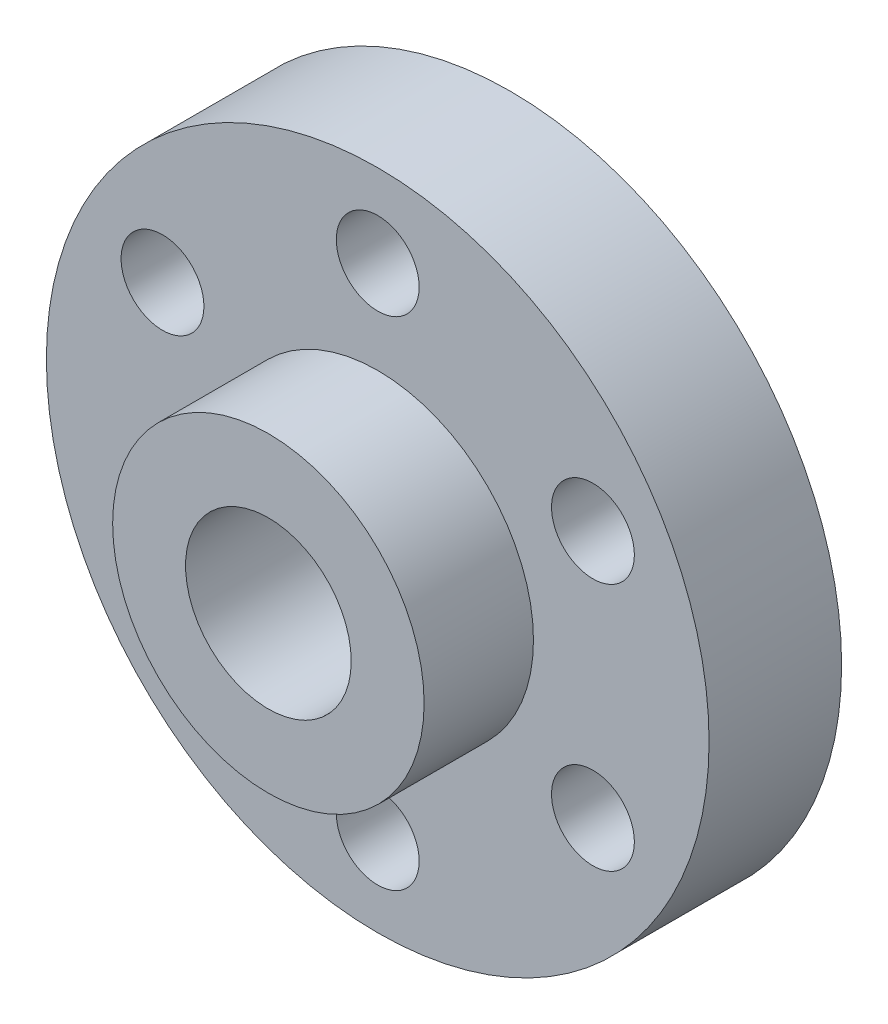
ISO-10303-21;
HEADER;
FILE_DESCRIPTION(('STEP AP214'),'2;1');
FILE_NAME('part.step','',(''),(''),'','','');
FILE_SCHEMA(('AUTOMOTIVE_DESIGN { 1 0 10303 214 1 1 1 1 }'));
ENDSEC;
DATA;
#1=APPLICATION_CONTEXT('core data for automotive mechanical design processes');
#2=APPLICATION_PROTOCOL_DEFINITION('international standard','automotive_design',2000,#1);
#3=PRODUCT_CONTEXT('',#1,'mechanical');
#4=PRODUCT('Part','Part','',(#3));
#5=PRODUCT_RELATED_PRODUCT_CATEGORY('part','',(#4));
#6=PRODUCT_DEFINITION_FORMATION('','',#4);
#7=PRODUCT_DEFINITION_CONTEXT('part definition',#1,'design');
#8=PRODUCT_DEFINITION('design','',#6,#7);
#9=PRODUCT_DEFINITION_SHAPE('','',#8);
#10=(LENGTH_UNIT() NAMED_UNIT(*) SI_UNIT(.MILLI.,.METRE.));
#11=(NAMED_UNIT(*) PLANE_ANGLE_UNIT() SI_UNIT($,.RADIAN.));
#12=(NAMED_UNIT(*) SI_UNIT($,.STERADIAN.) SOLID_ANGLE_UNIT());
#13=UNCERTAINTY_MEASURE_WITH_UNIT(LENGTH_MEASURE(1.E-05),#10,'distance_accuracy_value','');
#14=(GEOMETRIC_REPRESENTATION_CONTEXT(3) GLOBAL_UNCERTAINTY_ASSIGNED_CONTEXT((#13)) GLOBAL_UNIT_ASSIGNED_CONTEXT((#10,
#11,#12)) REPRESENTATION_CONTEXT('',''));
#15=CARTESIAN_POINT('',(0.,0.,0.));
#16=DIRECTION('',(0.,0.,1.));
#17=DIRECTION('',(1.,0.,0.));
#18=AXIS2_PLACEMENT_3D('',#15,#16,#17);
#19=CARTESIAN_POINT('',(0.,0.,5.08));
#20=DIRECTION('',(0.,0.,1.));
#21=DIRECTION('',(1.,0.,0.));
#22=AXIS2_PLACEMENT_3D('',#19,#20,#21);
#23=PLANE('',#22);
#24=CARTESIAN_POINT('',(0.,0.,5.08));
#25=DIRECTION('',(0.,0.,1.));
#26=DIRECTION('',(1.,0.,0.));
#27=AXIS2_PLACEMENT_3D('',#24,#25,#26);
#28=CIRCLE('',#27,5.969);
#29=CARTESIAN_POINT('',(5.969,0.,5.08));
#30=VERTEX_POINT('',#29);
#31=EDGE_CURVE('E100',#30,#30,#28,.T.);
#32=ORIENTED_EDGE('',*,*,#31,.F.);
#33=EDGE_LOOP('',(#32));
#34=FACE_BOUND('',#33,.T.);
#35=CARTESIAN_POINT('',(-8.24889197104678,-4.7625,5.08));
#36=DIRECTION('',(0.,0.,1.));
#37=DIRECTION('',(1.,0.,0.));
#38=AXIS2_PLACEMENT_3D('',#35,#36,#37);
#39=CIRCLE('',#38,1.5875);
#40=CARTESIAN_POINT('',(-6.66139197104678,-4.7625,5.08));
#41=VERTEX_POINT('',#40);
#42=EDGE_CURVE('E80',#41,#41,#39,.T.);
#43=ORIENTED_EDGE('',*,*,#42,.F.);
#44=EDGE_LOOP('',(#43));
#45=FACE_BOUND('',#44,.T.);
#46=CARTESIAN_POINT('',(8.24889197104678,-4.7625,5.08));
#47=DIRECTION('',(0.,0.,1.));
#48=DIRECTION('',(1.,0.,0.));
#49=AXIS2_PLACEMENT_3D('',#46,#47,#48);
#50=CIRCLE('',#49,1.5875);
#51=CARTESIAN_POINT('',(9.83639197104678,-4.7625,5.08));
#52=VERTEX_POINT('',#51);
#53=EDGE_CURVE('E64',#52,#52,#50,.T.);
#54=ORIENTED_EDGE('',*,*,#53,.F.);
#55=EDGE_LOOP('',(#54));
#56=FACE_BOUND('',#55,.T.);
#57=CARTESIAN_POINT('',(0.,9.525,5.08));
#58=DIRECTION('',(0.,0.,1.));
#59=DIRECTION('',(1.,0.,0.));
#60=AXIS2_PLACEMENT_3D('',#57,#58,#59);
#61=CIRCLE('',#60,1.5875);
#62=CARTESIAN_POINT('',(1.5875,9.525,5.08));
#63=VERTEX_POINT('',#62);
#64=EDGE_CURVE('E50',#63,#63,#61,.T.);
#65=ORIENTED_EDGE('',*,*,#64,.F.);
#66=EDGE_LOOP('',(#65));
#67=FACE_BOUND('',#66,.T.);
#68=CARTESIAN_POINT('',(0.,0.,5.08));
#69=DIRECTION('',(0.,0.,1.));
#70=DIRECTION('',(1.,0.,0.));
#71=AXIS2_PLACEMENT_3D('',#68,#69,#70);
#72=CIRCLE('',#71,12.7);
#73=CARTESIAN_POINT('',(12.7,0.,5.08));
#74=VERTEX_POINT('',#73);
#75=EDGE_CURVE('E10',#74,#74,#72,.T.);
#76=ORIENTED_EDGE('',*,*,#75,.T.);
#77=EDGE_LOOP('',(#76));
#78=FACE_BOUND('',#77,.T.);
#79=CARTESIAN_POINT('',(8.24889197104678,4.7625,5.08));
#80=DIRECTION('',(0.,0.,1.));
#81=DIRECTION('',(1.,0.,0.));
#82=AXIS2_PLACEMENT_3D('',#79,#80,#81);
#83=CIRCLE('',#82,1.5875);
#84=CARTESIAN_POINT('',(9.83639197104679,4.7625,5.08));
#85=VERTEX_POINT('',#84);
#86=EDGE_CURVE('E56',#85,#85,#83,.T.);
#87=ORIENTED_EDGE('',*,*,#86,.F.);
#88=EDGE_LOOP('',(#87));
#89=FACE_BOUND('',#88,.T.);
#90=CARTESIAN_POINT('',(0.,-9.525,5.08));
#91=DIRECTION('',(0.,0.,1.));
#92=DIRECTION('',(1.,0.,0.));
#93=AXIS2_PLACEMENT_3D('',#90,#91,#92);
#94=CIRCLE('',#93,1.5875);
#95=CARTESIAN_POINT('',(1.5875,-9.525,5.08));
#96=VERTEX_POINT('',#95);
#97=EDGE_CURVE('E72',#96,#96,#94,.T.);
#98=ORIENTED_EDGE('',*,*,#97,.F.);
#99=EDGE_LOOP('',(#98));
#100=FACE_BOUND('',#99,.T.);
#101=CARTESIAN_POINT('',(-8.24889197104678,4.7625,5.08));
#102=DIRECTION('',(0.,0.,1.));
#103=DIRECTION('',(1.,0.,0.));
#104=AXIS2_PLACEMENT_3D('',#101,#102,#103);
#105=CIRCLE('',#104,1.5875);
#106=CARTESIAN_POINT('',(-6.66139197104678,4.7625,5.08));
#107=VERTEX_POINT('',#106);
#108=EDGE_CURVE('E88',#107,#107,#105,.T.);
#109=ORIENTED_EDGE('',*,*,#108,.F.);
#110=EDGE_LOOP('',(#109));
#111=FACE_BOUND('',#110,.T.);
#112=ADVANCED_FACE('F37',(#34,#45,#56,#67,#78,#89,#100,#111),#23,.T.);
#113=CARTESIAN_POINT('',(0.,0.,0.));
#114=DIRECTION('',(0.,0.,1.));
#115=DIRECTION('',(1.,0.,0.));
#116=AXIS2_PLACEMENT_3D('',#113,#114,#115);
#117=PLANE('',#116);
#118=CARTESIAN_POINT('',(0.,0.,0.));
#119=DIRECTION('',(0.,0.,1.));
#120=DIRECTION('',(1.,0.,0.));
#121=AXIS2_PLACEMENT_3D('',#118,#119,#120);
#122=CIRCLE('',#121,3.175);
#123=CARTESIAN_POINT('',(3.175,0.,0.));
#124=VERTEX_POINT('',#123);
#125=EDGE_CURVE('E104',#124,#124,#122,.F.);
#126=ORIENTED_EDGE('',*,*,#125,.F.);
#127=EDGE_LOOP('',(#126));
#128=FACE_BOUND('',#127,.T.);
#129=CARTESIAN_POINT('',(0.,0.,0.));
#130=DIRECTION('',(0.,0.,1.));
#131=DIRECTION('',(1.,0.,0.));
#132=AXIS2_PLACEMENT_3D('',#129,#130,#131);
#133=CIRCLE('',#132,12.7);
#134=CARTESIAN_POINT('',(12.7,0.,0.));
#135=VERTEX_POINT('',#134);
#136=EDGE_CURVE('E41',#135,#135,#133,.T.);
#137=ORIENTED_EDGE('',*,*,#136,.F.);
#138=EDGE_LOOP('',(#137));
#139=FACE_BOUND('',#138,.T.);
#140=CARTESIAN_POINT('',(0.,9.525,0.));
#141=DIRECTION('',(0.,0.,1.));
#142=DIRECTION('',(1.,0.,0.));
#143=AXIS2_PLACEMENT_3D('',#140,#141,#142);
#144=CIRCLE('',#143,1.5875);
#145=CARTESIAN_POINT('',(1.5875,9.525,0.));
#146=VERTEX_POINT('',#145);
#147=EDGE_CURVE('E52',#146,#146,#144,.T.);
#148=ORIENTED_EDGE('',*,*,#147,.T.);
#149=EDGE_LOOP('',(#148));
#150=FACE_BOUND('',#149,.T.);
#151=CARTESIAN_POINT('',(8.24889197104678,4.7625,0.));
#152=DIRECTION('',(0.,0.,1.));
#153=DIRECTION('',(1.,0.,0.));
#154=AXIS2_PLACEMENT_3D('',#151,#152,#153);
#155=CIRCLE('',#154,1.5875);
#156=CARTESIAN_POINT('',(9.83639197104679,4.7625,0.));
#157=VERTEX_POINT('',#156);
#158=EDGE_CURVE('E60',#157,#157,#155,.T.);
#159=ORIENTED_EDGE('',*,*,#158,.T.);
#160=EDGE_LOOP('',(#159));
#161=FACE_BOUND('',#160,.T.);
#162=CARTESIAN_POINT('',(8.24889197104678,-4.7625,0.));
#163=DIRECTION('',(0.,0.,1.));
#164=DIRECTION('',(1.,0.,0.));
#165=AXIS2_PLACEMENT_3D('',#162,#163,#164);
#166=CIRCLE('',#165,1.5875);
#167=CARTESIAN_POINT('',(9.83639197104678,-4.7625,0.));
#168=VERTEX_POINT('',#167);
#169=EDGE_CURVE('E68',#168,#168,#166,.T.);
#170=ORIENTED_EDGE('',*,*,#169,.T.);
#171=EDGE_LOOP('',(#170));
#172=FACE_BOUND('',#171,.T.);
#173=CARTESIAN_POINT('',(0.,-9.525,0.));
#174=DIRECTION('',(0.,0.,1.));
#175=DIRECTION('',(1.,0.,0.));
#176=AXIS2_PLACEMENT_3D('',#173,#174,#175);
#177=CIRCLE('',#176,1.5875);
#178=CARTESIAN_POINT('',(1.5875,-9.525,0.));
#179=VERTEX_POINT('',#178);
#180=EDGE_CURVE('E76',#179,#179,#177,.T.);
#181=ORIENTED_EDGE('',*,*,#180,.T.);
#182=EDGE_LOOP('',(#181));
#183=FACE_BOUND('',#182,.T.);
#184=CARTESIAN_POINT('',(-8.24889197104678,-4.7625,0.));
#185=DIRECTION('',(0.,0.,1.));
#186=DIRECTION('',(1.,0.,0.));
#187=AXIS2_PLACEMENT_3D('',#184,#185,#186);
#188=CIRCLE('',#187,1.5875);
#189=CARTESIAN_POINT('',(-6.66139197104678,-4.7625,0.));
#190=VERTEX_POINT('',#189);
#191=EDGE_CURVE('E84',#190,#190,#188,.T.);
#192=ORIENTED_EDGE('',*,*,#191,.T.);
#193=EDGE_LOOP('',(#192));
#194=FACE_BOUND('',#193,.T.);
#195=CARTESIAN_POINT('',(-8.24889197104678,4.7625,0.));
#196=DIRECTION('',(0.,0.,1.));
#197=DIRECTION('',(1.,0.,0.));
#198=AXIS2_PLACEMENT_3D('',#195,#196,#197);
#199=CIRCLE('',#198,1.5875);
#200=CARTESIAN_POINT('',(-6.66139197104678,4.7625,0.));
#201=VERTEX_POINT('',#200);
#202=EDGE_CURVE('E92',#201,#201,#199,.T.);
#203=ORIENTED_EDGE('',*,*,#202,.T.);
#204=EDGE_LOOP('',(#203));
#205=FACE_BOUND('',#204,.T.);
#206=ADVANCED_FACE('F133',(#128,#139,#150,#161,#172,#183,#194,#205),#117,.F.);
#207=CARTESIAN_POINT('',(0.,0.,5.08));
#208=DIRECTION('',(0.,0.,-1.));
#209=DIRECTION('',(-1.,0.,0.));
#210=AXIS2_PLACEMENT_3D('',#207,#208,#209);
#211=CYLINDRICAL_SURFACE('',#210,12.7);
#212=ORIENTED_EDGE('',*,*,#75,.F.);
#213=EDGE_LOOP('',(#212));
#214=FACE_BOUND('',#213,.T.);
#215=ORIENTED_EDGE('',*,*,#136,.T.);
#216=EDGE_LOOP('',(#215));
#217=FACE_BOUND('',#216,.T.);
#218=ADVANCED_FACE('F39',(#214,#217),#211,.T.);
#219=CARTESIAN_POINT('',(0.,9.525,5.08));
#220=DIRECTION('',(0.,0.,-1.));
#221=DIRECTION('',(-1.,0.,0.));
#222=AXIS2_PLACEMENT_3D('',#219,#220,#221);
#223=CYLINDRICAL_SURFACE('',#222,1.5875);
#224=ORIENTED_EDGE('',*,*,#64,.T.);
#225=EDGE_LOOP('',(#224));
#226=FACE_BOUND('',#225,.T.);
#227=ORIENTED_EDGE('',*,*,#147,.F.);
#228=EDGE_LOOP('',(#227));
#229=FACE_BOUND('',#228,.T.);
#230=ADVANCED_FACE('F158',(#226,#229),#223,.F.);
#231=CARTESIAN_POINT('',(8.24889197104678,4.7625,5.08));
#232=DIRECTION('',(0.,0.,-1.));
#233=DIRECTION('',(-1.,0.,0.));
#234=AXIS2_PLACEMENT_3D('',#231,#232,#233);
#235=CYLINDRICAL_SURFACE('',#234,1.5875);
#236=ORIENTED_EDGE('',*,*,#86,.T.);
#237=EDGE_LOOP('',(#236));
#238=FACE_BOUND('',#237,.T.);
#239=ORIENTED_EDGE('',*,*,#158,.F.);
#240=EDGE_LOOP('',(#239));
#241=FACE_BOUND('',#240,.T.);
#242=ADVANCED_FACE('F165',(#238,#241),#235,.F.);
#243=CARTESIAN_POINT('',(8.24889197104678,-4.7625,5.08));
#244=DIRECTION('',(0.,0.,-1.));
#245=DIRECTION('',(-1.,0.,0.));
#246=AXIS2_PLACEMENT_3D('',#243,#244,#245);
#247=CYLINDRICAL_SURFACE('',#246,1.5875);
#248=ORIENTED_EDGE('',*,*,#53,.T.);
#249=EDGE_LOOP('',(#248));
#250=FACE_BOUND('',#249,.T.);
#251=ORIENTED_EDGE('',*,*,#169,.F.);
#252=EDGE_LOOP('',(#251));
#253=FACE_BOUND('',#252,.T.);
#254=ADVANCED_FACE('F169',(#250,#253),#247,.F.);
#255=CARTESIAN_POINT('',(0.,-9.525,5.08));
#256=DIRECTION('',(0.,0.,-1.));
#257=DIRECTION('',(-1.,0.,0.));
#258=AXIS2_PLACEMENT_3D('',#255,#256,#257);
#259=CYLINDRICAL_SURFACE('',#258,1.5875);
#260=ORIENTED_EDGE('',*,*,#97,.T.);
#261=EDGE_LOOP('',(#260));
#262=FACE_BOUND('',#261,.T.);
#263=ORIENTED_EDGE('',*,*,#180,.F.);
#264=EDGE_LOOP('',(#263));
#265=FACE_BOUND('',#264,.T.);
#266=ADVANCED_FACE('F173',(#262,#265),#259,.F.);
#267=CARTESIAN_POINT('',(-8.24889197104678,-4.7625,5.08));
#268=DIRECTION('',(0.,0.,-1.));
#269=DIRECTION('',(-1.,0.,0.));
#270=AXIS2_PLACEMENT_3D('',#267,#268,#269);
#271=CYLINDRICAL_SURFACE('',#270,1.5875);
#272=ORIENTED_EDGE('',*,*,#42,.T.);
#273=EDGE_LOOP('',(#272));
#274=FACE_BOUND('',#273,.T.);
#275=ORIENTED_EDGE('',*,*,#191,.F.);
#276=EDGE_LOOP('',(#275));
#277=FACE_BOUND('',#276,.T.);
#278=ADVANCED_FACE('F149',(#274,#277),#271,.F.);
#279=CARTESIAN_POINT('',(-8.24889197104678,4.7625,5.08));
#280=DIRECTION('',(0.,0.,-1.));
#281=DIRECTION('',(-1.,0.,0.));
#282=AXIS2_PLACEMENT_3D('',#279,#280,#281);
#283=CYLINDRICAL_SURFACE('',#282,1.5875);
#284=ORIENTED_EDGE('',*,*,#108,.T.);
#285=EDGE_LOOP('',(#284));
#286=FACE_BOUND('',#285,.T.);
#287=ORIENTED_EDGE('',*,*,#202,.F.);
#288=EDGE_LOOP('',(#287));
#289=FACE_BOUND('',#288,.T.);
#290=ADVANCED_FACE('F127',(#286,#289),#283,.F.);
#291=CARTESIAN_POINT('',(0.,0.,9.271));
#292=DIRECTION('',(0.,0.,-1.));
#293=DIRECTION('',(-1.,0.,0.));
#294=AXIS2_PLACEMENT_3D('',#291,#292,#293);
#295=CYLINDRICAL_SURFACE('',#294,5.969);
#296=CARTESIAN_POINT('',(0.,0.,9.271));
#297=DIRECTION('',(0.,0.,1.));
#298=DIRECTION('',(1.,0.,0.));
#299=AXIS2_PLACEMENT_3D('',#296,#297,#298);
#300=CIRCLE('',#299,5.969);
#301=CARTESIAN_POINT('',(5.969,0.,9.271));
#302=VERTEX_POINT('',#301);
#303=EDGE_CURVE('E96',#302,#302,#300,.T.);
#304=ORIENTED_EDGE('',*,*,#303,.F.);
#305=EDGE_LOOP('',(#304));
#306=FACE_BOUND('',#305,.T.);
#307=ORIENTED_EDGE('',*,*,#31,.T.);
#308=EDGE_LOOP('',(#307));
#309=FACE_BOUND('',#308,.T.);
#310=ADVANCED_FACE('F121',(#306,#309),#295,.T.);
#311=CARTESIAN_POINT('',(0.,0.,9.271));
#312=DIRECTION('',(0.,0.,1.));
#313=DIRECTION('',(1.,0.,0.));
#314=AXIS2_PLACEMENT_3D('',#311,#312,#313);
#315=PLANE('',#314);
#316=CARTESIAN_POINT('',(0.,0.,9.271));
#317=DIRECTION('',(0.,0.,1.));
#318=DIRECTION('',(1.,0.,0.));
#319=AXIS2_PLACEMENT_3D('',#316,#317,#318);
#320=CIRCLE('',#319,3.175);
#321=CARTESIAN_POINT('',(3.175,0.,9.271));
#322=VERTEX_POINT('',#321);
#323=EDGE_CURVE('E111',#322,#322,#320,.T.);
#324=ORIENTED_EDGE('',*,*,#323,.F.);
#325=EDGE_LOOP('',(#324));
#326=FACE_BOUND('',#325,.T.);
#327=ORIENTED_EDGE('',*,*,#303,.T.);
#328=EDGE_LOOP('',(#327));
#329=FACE_BOUND('',#328,.T.);
#330=ADVANCED_FACE('F118',(#326,#329),#315,.T.);
#331=CARTESIAN_POINT('',(0.,0.,-8.98025612106915));
#332=DIRECTION('',(0.,0.,1.));
#333=DIRECTION('',(1.,0.,0.));
#334=AXIS2_PLACEMENT_3D('',#331,#332,#333);
#335=CYLINDRICAL_SURFACE('',#334,3.175);
#336=CARTESIAN_POINT('',(3.175,0.,0.));
#337=CARTESIAN_POINT('',(3.175,0.,0.0965729166666652));
#338=CARTESIAN_POINT('',(3.175,0.,0.193145833333332));
#339=CARTESIAN_POINT('',(3.175,0.,0.386291666666666));
#340=CARTESIAN_POINT('',(3.175,0.,0.482864583333332));
#341=CARTESIAN_POINT('',(3.175,0.,0.676010416666665));
#342=CARTESIAN_POINT('',(3.175,0.,0.772583333333331));
#343=CARTESIAN_POINT('',(3.175,0.,0.965729166666665));
#344=CARTESIAN_POINT('',(3.175,0.,1.06230208333333));
#345=CARTESIAN_POINT('',(3.175,0.,1.25544791666667));
#346=CARTESIAN_POINT('',(3.175,0.,1.35202083333333));
#347=CARTESIAN_POINT('',(3.175,0.,1.54516666666667));
#348=CARTESIAN_POINT('',(3.175,0.,1.64173958333333));
#349=CARTESIAN_POINT('',(3.175,0.,1.83488541666666));
#350=CARTESIAN_POINT('',(3.175,0.,1.93145833333333));
#351=CARTESIAN_POINT('',(3.175,0.,2.12460416666666));
#352=CARTESIAN_POINT('',(3.175,0.,2.22117708333333));
#353=CARTESIAN_POINT('',(3.175,0.,2.41432291666667));
#354=CARTESIAN_POINT('',(3.175,0.,2.51089583333333));
#355=CARTESIAN_POINT('',(3.175,0.,2.70404166666667));
#356=CARTESIAN_POINT('',(3.175,0.,2.80061458333333));
#357=CARTESIAN_POINT('',(3.175,0.,2.99376041666667));
#358=CARTESIAN_POINT('',(3.175,0.,3.09033333333333));
#359=CARTESIAN_POINT('',(3.175,0.,3.28347916666667));
#360=CARTESIAN_POINT('',(3.175,0.,3.38005208333333));
#361=CARTESIAN_POINT('',(3.175,0.,3.57319791666667));
#362=CARTESIAN_POINT('',(3.175,0.,3.66977083333333));
#363=CARTESIAN_POINT('',(3.175,0.,3.86291666666667));
#364=CARTESIAN_POINT('',(3.175,0.,3.95948958333333));
#365=CARTESIAN_POINT('',(3.175,0.,4.15263541666667));
#366=CARTESIAN_POINT('',(3.175,0.,4.24920833333333));
#367=CARTESIAN_POINT('',(3.175,0.,4.44235416666666));
#368=CARTESIAN_POINT('',(3.175,0.,4.53892708333333));
#369=CARTESIAN_POINT('',(3.175,0.,4.73207291666667));
#370=CARTESIAN_POINT('',(3.175,0.,4.82864583333333));
#371=CARTESIAN_POINT('',(3.175,0.,5.02179166666667));
#372=CARTESIAN_POINT('',(3.175,0.,5.11836458333333));
#373=CARTESIAN_POINT('',(3.175,0.,5.31151041666667));
#374=CARTESIAN_POINT('',(3.175,0.,5.40808333333333));
#375=CARTESIAN_POINT('',(3.175,0.,5.60122916666667));
#376=CARTESIAN_POINT('',(3.175,0.,5.69780208333333));
#377=CARTESIAN_POINT('',(3.175,0.,5.89094791666667));
#378=CARTESIAN_POINT('',(3.175,0.,5.98752083333333));
#379=CARTESIAN_POINT('',(3.175,0.,6.18066666666667));
#380=CARTESIAN_POINT('',(3.175,0.,6.27723958333333));
#381=CARTESIAN_POINT('',(3.175,0.,6.47038541666667));
#382=CARTESIAN_POINT('',(3.175,0.,6.56695833333333));
#383=CARTESIAN_POINT('',(3.175,0.,6.76010416666666));
#384=CARTESIAN_POINT('',(3.175,0.,6.85667708333333));
#385=CARTESIAN_POINT('',(3.175,0.,7.04982291666666));
#386=CARTESIAN_POINT('',(3.175,0.,7.14639583333333));
#387=CARTESIAN_POINT('',(3.175,0.,7.33954166666667));
#388=CARTESIAN_POINT('',(3.175,0.,7.43611458333333));
#389=CARTESIAN_POINT('',(3.175,0.,7.62926041666667));
#390=CARTESIAN_POINT('',(3.175,0.,7.72583333333333));
#391=CARTESIAN_POINT('',(3.175,0.,7.91897916666666));
#392=CARTESIAN_POINT('',(3.175,0.,8.01555208333333));
#393=CARTESIAN_POINT('',(3.175,0.,8.20869791666667));
#394=CARTESIAN_POINT('',(3.175,0.,8.30527083333333));
#395=CARTESIAN_POINT('',(3.175,0.,8.49841666666666));
#396=CARTESIAN_POINT('',(3.175,0.,8.59498958333333));
#397=CARTESIAN_POINT('',(3.175,0.,8.78813541666666));
#398=CARTESIAN_POINT('',(3.175,0.,8.88470833333333));
#399=CARTESIAN_POINT('',(3.175,0.,9.07785416666666));
#400=CARTESIAN_POINT('',(3.175,0.,9.17442708333333));
#401=CARTESIAN_POINT('',(3.175,0.,9.271));
#402=B_SPLINE_CURVE_WITH_KNOTS('',3,(#336,#337,#338,#339,#340,#341,#342,#343,#344,#345,#346,
#347,#348,#349,#350,#351,#352,#353,#354,#355,#356,#357,#358,#359,#360,#361,#362,#363,#364,#365,
#366,#367,#368,#369,#370,#371,#372,#373,#374,#375,#376,#377,#378,#379,#380,#381,#382,#383,#384,
#385,#386,#387,#388,#389,#390,#391,#392,#393,#394,#395,#396,#397,#398,#399,#400,#401),
.UNSPECIFIED.,.F.,.F.,(4,2,2,2,2,2,2,2,2,2,2,2,2,2,2,2,2,2,2,2,2,2,2,2,2,2,2,2,2,2,2,2,4),(0.,
0.289718750000001,0.5794375,0.869156249999999,1.158875,1.44859375,1.7383125,2.02803125,2.31775,
2.60746875,2.8971875,3.18690625,3.476625,3.76634375,4.0560625,4.34578125,4.6355,4.92521875,
5.2149375,5.50465625,5.794375,6.08409375,6.3738125,6.66353125,6.95325,7.24296875,7.5326875,
7.82240625,8.112125,8.40184375,8.6915625,8.98128125,9.271),.UNSPECIFIED.);
#403=EDGE_CURVE('BSEAM116',#124,#322,#402,.T.);
#404=ORIENTED_EDGE('',*,*,#125,.T.);
#405=ORIENTED_EDGE('',*,*,#323,.T.);
#406=ORIENTED_EDGE('',*,*,#403,.T.);
#407=ORIENTED_EDGE('',*,*,#403,.F.);
#408=EDGE_LOOP('',(#404,#406,#405,#407));
#409=FACE_BOUND('',#408,.T.);
#410=ADVANCED_FACE('F116',(#409),#335,.F.);
#411=CLOSED_SHELL('',(#112,#206,#218,#230,#242,#254,#266,#278,#290,#310,#330,#410));
#412=MANIFOLD_SOLID_BREP('B2',#411);
#413=ADVANCED_BREP_SHAPE_REPRESENTATION('',(#18,#412),#14);
#414=SHAPE_DEFINITION_REPRESENTATION(#9,#413);
ENDSEC;
END-ISO-10303-21;
